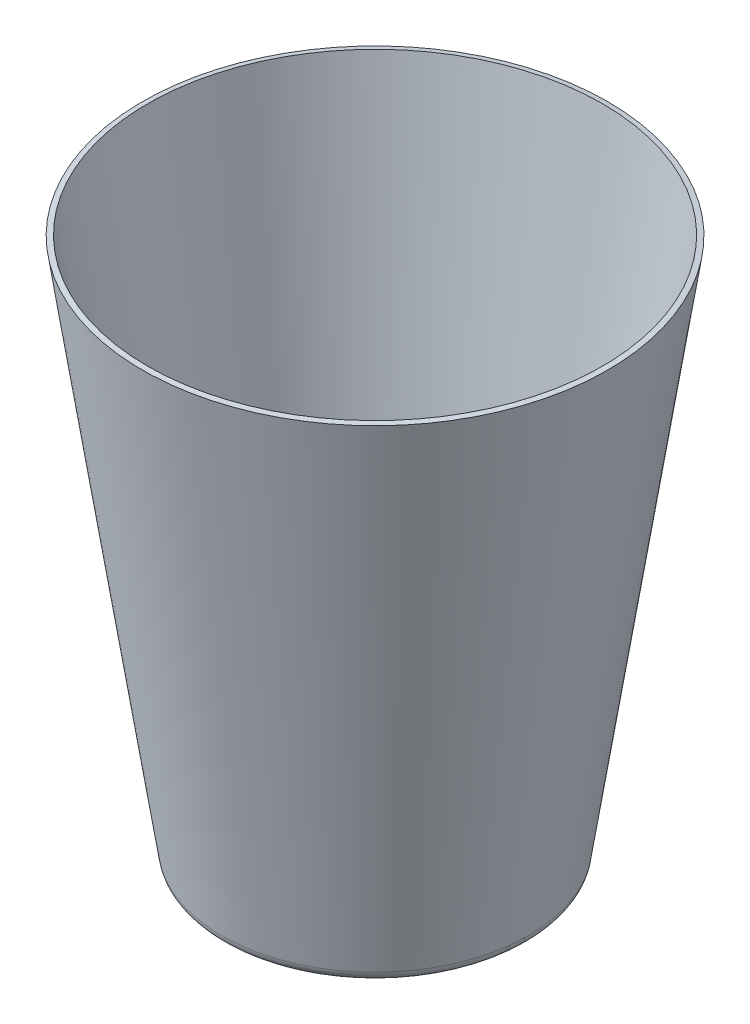
ISO-10303-21;
HEADER;
FILE_DESCRIPTION(('STEP AP214'),'2;1');
FILE_NAME('part.step','',(''),(''),'','','');
FILE_SCHEMA(('AUTOMOTIVE_DESIGN { 1 0 10303 214 1 1 1 1 }'));
ENDSEC;
DATA;
#1=APPLICATION_CONTEXT('core data for automotive mechanical design processes');
#2=APPLICATION_PROTOCOL_DEFINITION('international standard','automotive_design',2000,#1);
#3=PRODUCT_CONTEXT('',#1,'mechanical');
#4=PRODUCT('Part','Part','',(#3));
#5=PRODUCT_RELATED_PRODUCT_CATEGORY('part','',(#4));
#6=PRODUCT_DEFINITION_FORMATION('','',#4);
#7=PRODUCT_DEFINITION_CONTEXT('part definition',#1,'design');
#8=PRODUCT_DEFINITION('design','',#6,#7);
#9=PRODUCT_DEFINITION_SHAPE('','',#8);
#10=(LENGTH_UNIT() NAMED_UNIT(*) SI_UNIT(.MILLI.,.METRE.));
#11=(NAMED_UNIT(*) PLANE_ANGLE_UNIT() SI_UNIT($,.RADIAN.));
#12=(NAMED_UNIT(*) SI_UNIT($,.STERADIAN.) SOLID_ANGLE_UNIT());
#13=UNCERTAINTY_MEASURE_WITH_UNIT(LENGTH_MEASURE(1.E-05),#10,'distance_accuracy_value','');
#14=(GEOMETRIC_REPRESENTATION_CONTEXT(3) GLOBAL_UNCERTAINTY_ASSIGNED_CONTEXT((#13)) GLOBAL_UNIT_ASSIGNED_CONTEXT((#10,
#11,#12)) REPRESENTATION_CONTEXT('',''));
#15=CARTESIAN_POINT('',(0.,0.,0.));
#16=DIRECTION('',(0.,0.,1.));
#17=DIRECTION('',(1.,0.,0.));
#18=AXIS2_PLACEMENT_3D('',#15,#16,#17);
#19=CARTESIAN_POINT('',(0.,1.70390529981906,0.));
#20=DIRECTION('',(0.,1.,0.));
#21=DIRECTION('',(0.,0.,1.));
#22=AXIS2_PLACEMENT_3D('',#19,#20,#21);
#23=CONICAL_SURFACE('',#22,23.4050694600335,0.148593572288457);
#24=CARTESIAN_POINT('',(0.,82.5,0.));
#25=DIRECTION('',(0.,-1.,0.));
#26=DIRECTION('',(0.,0.,-1.));
#27=AXIS2_PLACEMENT_3D('',#24,#25,#26);
#28=CIRCLE('',#27,35.5);
#29=CARTESIAN_POINT('',(0.,82.5,-35.5));
#30=VERTEX_POINT('',#29);
#31=EDGE_CURVE('E10',#30,#30,#28,.T.);
#32=ORIENTED_EDGE('',*,*,#31,.T.);
#33=EDGE_LOOP('',(#32));
#34=FACE_BOUND('',#33,.T.);
#35=CARTESIAN_POINT('',(0.,1.70390529981906,0.));
#36=DIRECTION('',(0.,-1.,0.));
#37=DIRECTION('',(0.,0.,-1.));
#38=AXIS2_PLACEMENT_3D('',#35,#36,#37);
#39=CIRCLE('',#38,23.4050694600335);
#40=CARTESIAN_POINT('',(0.,1.70390529981906,-23.4050694600335));
#41=VERTEX_POINT('',#40);
#42=EDGE_CURVE('E52',#41,#41,#39,.T.);
#43=ORIENTED_EDGE('',*,*,#42,.F.);
#44=EDGE_LOOP('',(#43));
#45=FACE_BOUND('',#44,.T.);
#46=ADVANCED_FACE('F30',(#34,#45),#23,.T.);
#47=CARTESIAN_POINT('',(0.,82.6184378800724,0.));
#48=DIRECTION('',(0.,-1.,0.));
#49=DIRECTION('',(0.,0.,-1.));
#50=AXIS2_PLACEMENT_3D('',#47,#48,#49);
#51=CONICAL_SURFACE('',#50,34.708815780893,1.42220275450645);
#52=ORIENTED_EDGE('',*,*,#31,.F.);
#53=EDGE_LOOP('',(#52));
#54=FACE_BOUND('',#53,.T.);
#55=CARTESIAN_POINT('',(0.,82.6184378800724,0.));
#56=DIRECTION('',(0.,-1.,0.));
#57=DIRECTION('',(0.,0.,-1.));
#58=AXIS2_PLACEMENT_3D('',#55,#56,#57);
#59=CIRCLE('',#58,34.708815780893);
#60=CARTESIAN_POINT('',(0.,82.6184378800724,-34.708815780893));
#61=VERTEX_POINT('',#60);
#62=EDGE_CURVE('E36',#61,#61,#59,.T.);
#63=ORIENTED_EDGE('',*,*,#62,.T.);
#64=EDGE_LOOP('',(#63));
#65=FACE_BOUND('',#64,.T.);
#66=ADVANCED_FACE('F60',(#54,#65),#51,.T.);
#67=CARTESIAN_POINT('',(0.,1.82234317989144,0.));
#68=DIRECTION('',(0.,1.,0.));
#69=DIRECTION('',(0.,0.,1.));
#70=AXIS2_PLACEMENT_3D('',#67,#68,#69);
#71=CONICAL_SURFACE('',#70,22.6138852409265,0.148593572288457);
#72=ORIENTED_EDGE('',*,*,#62,.F.);
#73=EDGE_LOOP('',(#72));
#74=FACE_BOUND('',#73,.T.);
#75=CARTESIAN_POINT('',(0.,1.82234317989144,0.));
#76=DIRECTION('',(0.,-1.,0.));
#77=DIRECTION('',(0.,0.,-1.));
#78=AXIS2_PLACEMENT_3D('',#75,#76,#77);
#79=CIRCLE('',#78,22.6138852409265);
#80=CARTESIAN_POINT('',(0.,1.82234317989144,-22.6138852409265));
#81=VERTEX_POINT('',#80);
#82=EDGE_CURVE('E40',#81,#81,#79,.T.);
#83=ORIENTED_EDGE('',*,*,#82,.T.);
#84=EDGE_LOOP('',(#83));
#85=FACE_BOUND('',#84,.T.);
#86=ADVANCED_FACE('F64',(#74,#85),#71,.F.);
#87=CARTESIAN_POINT('',(0.,2.,0.));
#88=DIRECTION('',(0.,-1.,0.));
#89=DIRECTION('',(0.,0.,-1.));
#90=AXIS2_PLACEMENT_3D('',#87,#88,#89);
#91=TOROIDAL_SURFACE('',#90,21.427108912266,1.2);
#92=ORIENTED_EDGE('',*,*,#82,.F.);
#93=EDGE_LOOP('',(#92));
#94=FACE_BOUND('',#93,.T.);
#95=CARTESIAN_POINT('',(0.,0.8,0.));
#96=DIRECTION('',(0.,-1.,0.));
#97=DIRECTION('',(0.,0.,-1.));
#98=AXIS2_PLACEMENT_3D('',#95,#96,#97);
#99=CIRCLE('',#98,21.427108912266);
#100=CARTESIAN_POINT('',(0.,0.8,-21.427108912266));
#101=VERTEX_POINT('',#100);
#102=EDGE_CURVE('E44',#101,#101,#99,.T.);
#103=ORIENTED_EDGE('',*,*,#102,.T.);
#104=EDGE_LOOP('',(#103));
#105=FACE_BOUND('',#104,.T.);
#106=ADVANCED_FACE('F69',(#94,#105),#91,.F.);
#107=CARTESIAN_POINT('',(0.,0.8,0.));
#108=DIRECTION('',(0.,-1.,0.));
#109=DIRECTION('',(0.,0.,-1.));
#110=AXIS2_PLACEMENT_3D('',#107,#108,#109);
#111=PLANE('',#110);
#112=ORIENTED_EDGE('',*,*,#102,.F.);
#113=EDGE_LOOP('',(#112));
#114=FACE_BOUND('',#113,.T.);
#115=ADVANCED_FACE('F75',(#114),#111,.F.);
#116=CARTESIAN_POINT('',(0.,0.,0.));
#117=DIRECTION('',(0.,-1.,0.));
#118=DIRECTION('',(0.,0.,-1.));
#119=AXIS2_PLACEMENT_3D('',#116,#117,#118);
#120=PLANE('',#119);
#121=CARTESIAN_POINT('',(0.,0.,0.));
#122=DIRECTION('',(0.,-1.,0.));
#123=DIRECTION('',(0.,0.,-1.));
#124=AXIS2_PLACEMENT_3D('',#121,#122,#123);
#125=CIRCLE('',#124,21.427108912266);
#126=CARTESIAN_POINT('',(0.,0.,-21.427108912266));
#127=VERTEX_POINT('',#126);
#128=EDGE_CURVE('E49',#127,#127,#125,.T.);
#129=ORIENTED_EDGE('',*,*,#128,.T.);
#130=EDGE_LOOP('',(#129));
#131=FACE_BOUND('',#130,.T.);
#132=ADVANCED_FACE('F79',(#131),#120,.T.);
#133=CARTESIAN_POINT('',(0.,2.,0.));
#134=DIRECTION('',(0.,-1.,0.));
#135=DIRECTION('',(0.,0.,-1.));
#136=AXIS2_PLACEMENT_3D('',#133,#134,#135);
#137=TOROIDAL_SURFACE('',#136,21.427108912266,2.);
#138=ORIENTED_EDGE('',*,*,#42,.T.);
#139=EDGE_LOOP('',(#138));
#140=FACE_BOUND('',#139,.T.);
#141=ORIENTED_EDGE('',*,*,#128,.F.);
#142=EDGE_LOOP('',(#141));
#143=FACE_BOUND('',#142,.T.);
#144=ADVANCED_FACE('F56',(#140,#143),#137,.T.);
#145=CLOSED_SHELL('',(#46,#66,#86,#106,#115,#132,#144));
#146=MANIFOLD_SOLID_BREP('B2',#145);
#147=ADVANCED_BREP_SHAPE_REPRESENTATION('',(#18,#146),#14);
#148=SHAPE_DEFINITION_REPRESENTATION(#9,#147);
ENDSEC;
END-ISO-10303-21;
